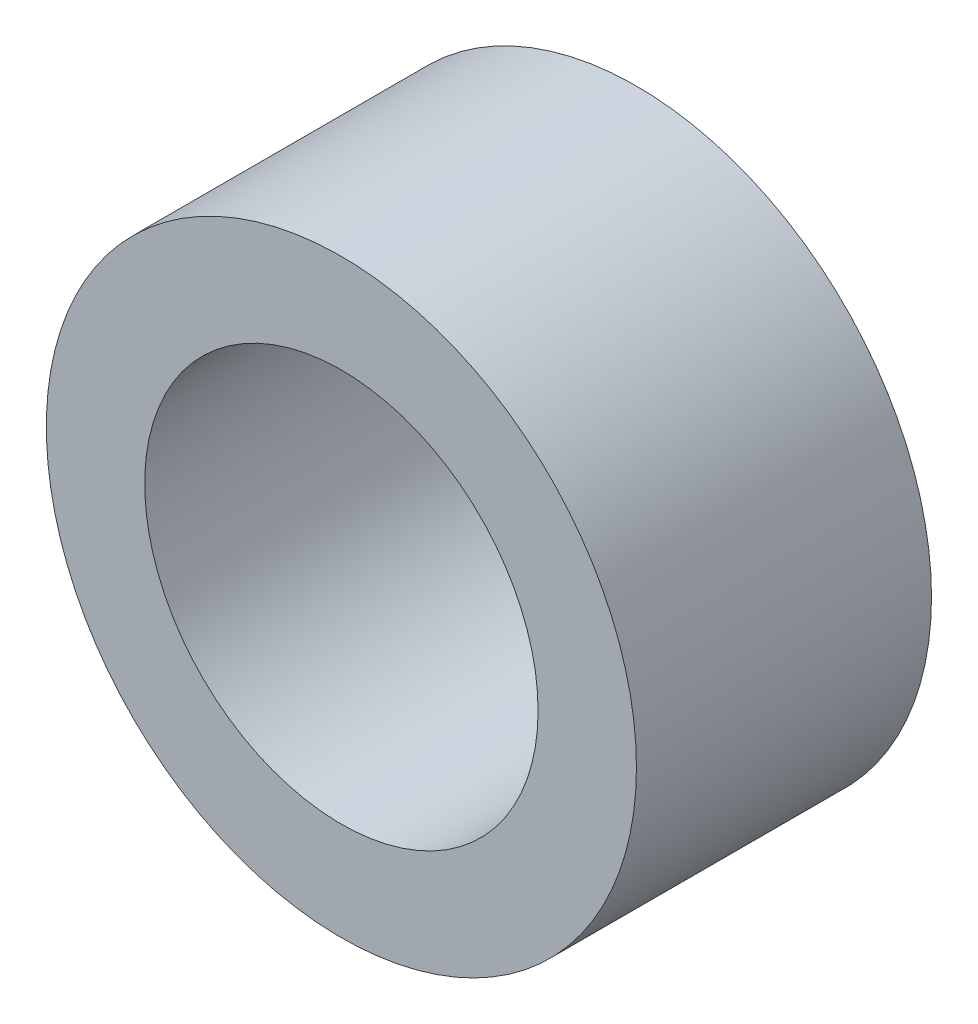
ISO-10303-21;
HEADER;
FILE_DESCRIPTION(('STEP AP214'),'2;1');
FILE_NAME('part.step','',(''),(''),'','','');
FILE_SCHEMA(('AUTOMOTIVE_DESIGN { 1 0 10303 214 1 1 1 1 }'));
ENDSEC;
DATA;
#1=APPLICATION_CONTEXT('core data for automotive mechanical design processes');
#2=APPLICATION_PROTOCOL_DEFINITION('international standard','automotive_design',2000,#1);
#3=PRODUCT_CONTEXT('',#1,'mechanical');
#4=PRODUCT('Part','Part','',(#3));
#5=PRODUCT_RELATED_PRODUCT_CATEGORY('part','',(#4));
#6=PRODUCT_DEFINITION_FORMATION('','',#4);
#7=PRODUCT_DEFINITION_CONTEXT('part definition',#1,'design');
#8=PRODUCT_DEFINITION('design','',#6,#7);
#9=PRODUCT_DEFINITION_SHAPE('','',#8);
#10=(LENGTH_UNIT() NAMED_UNIT(*) SI_UNIT(.MILLI.,.METRE.));
#11=(NAMED_UNIT(*) PLANE_ANGLE_UNIT() SI_UNIT($,.RADIAN.));
#12=(NAMED_UNIT(*) SI_UNIT($,.STERADIAN.) SOLID_ANGLE_UNIT());
#13=UNCERTAINTY_MEASURE_WITH_UNIT(LENGTH_MEASURE(1.E-05),#10,'distance_accuracy_value','');
#14=(GEOMETRIC_REPRESENTATION_CONTEXT(3) GLOBAL_UNCERTAINTY_ASSIGNED_CONTEXT((#13)) GLOBAL_UNIT_ASSIGNED_CONTEXT((#10,
#11,#12)) REPRESENTATION_CONTEXT('',''));
#15=CARTESIAN_POINT('',(0.,0.,0.));
#16=DIRECTION('',(0.,0.,1.));
#17=DIRECTION('',(1.,0.,0.));
#18=AXIS2_PLACEMENT_3D('',#15,#16,#17);
#19=CARTESIAN_POINT('',(0.,0.,1.5));
#20=DIRECTION('',(0.,0.,1.));
#21=DIRECTION('',(1.,0.,0.));
#22=AXIS2_PLACEMENT_3D('',#19,#20,#21);
#23=PLANE('',#22);
#24=CARTESIAN_POINT('',(0.,0.,1.5));
#25=DIRECTION('',(0.,0.,1.));
#26=DIRECTION('',(1.,0.,0.));
#27=AXIS2_PLACEMENT_3D('',#24,#25,#26);
#28=CIRCLE('',#27,3.);
#29=CARTESIAN_POINT('',(3.,0.,1.5));
#30=VERTEX_POINT('',#29);
#31=EDGE_CURVE('E10',#30,#30,#28,.T.);
#32=ORIENTED_EDGE('',*,*,#31,.T.);
#33=EDGE_LOOP('',(#32));
#34=FACE_BOUND('',#33,.T.);
#35=CARTESIAN_POINT('',(0.,0.,1.5));
#36=DIRECTION('',(0.,0.,1.));
#37=DIRECTION('',(1.,0.,0.));
#38=AXIS2_PLACEMENT_3D('',#35,#36,#37);
#39=CIRCLE('',#38,2.);
#40=CARTESIAN_POINT('',(2.,0.,1.5));
#41=VERTEX_POINT('',#40);
#42=EDGE_CURVE('E54',#41,#41,#39,.T.);
#43=ORIENTED_EDGE('',*,*,#42,.F.);
#44=EDGE_LOOP('',(#43));
#45=FACE_BOUND('',#44,.T.);
#46=ADVANCED_FACE('F41',(#34,#45),#23,.T.);
#47=CARTESIAN_POINT('',(0.,0.,-1.5));
#48=DIRECTION('',(0.,0.,1.));
#49=DIRECTION('',(1.,0.,0.));
#50=AXIS2_PLACEMENT_3D('',#47,#48,#49);
#51=PLANE('',#50);
#52=CARTESIAN_POINT('',(0.,0.,-1.5));
#53=DIRECTION('',(0.,0.,1.));
#54=DIRECTION('',(1.,0.,0.));
#55=AXIS2_PLACEMENT_3D('',#52,#53,#54);
#56=CIRCLE('',#55,3.);
#57=CARTESIAN_POINT('',(3.,0.,-1.5));
#58=VERTEX_POINT('',#57);
#59=EDGE_CURVE('E45',#58,#58,#56,.T.);
#60=ORIENTED_EDGE('',*,*,#59,.F.);
#61=EDGE_LOOP('',(#60));
#62=FACE_BOUND('',#61,.T.);
#63=CARTESIAN_POINT('',(0.,0.,-1.5));
#64=DIRECTION('',(0.,0.,1.));
#65=DIRECTION('',(1.,0.,0.));
#66=AXIS2_PLACEMENT_3D('',#63,#64,#65);
#67=CIRCLE('',#66,2.);
#68=CARTESIAN_POINT('',(2.,0.,-1.5));
#69=VERTEX_POINT('',#68);
#70=EDGE_CURVE('E56',#69,#69,#67,.T.);
#71=ORIENTED_EDGE('',*,*,#70,.T.);
#72=EDGE_LOOP('',(#71));
#73=FACE_BOUND('',#72,.T.);
#74=ADVANCED_FACE('F68',(#62,#73),#51,.F.);
#75=CARTESIAN_POINT('',(0.,0.,1.5));
#76=DIRECTION('',(0.,0.,-1.));
#77=DIRECTION('',(-1.,0.,0.));
#78=AXIS2_PLACEMENT_3D('',#75,#76,#77);
#79=CYLINDRICAL_SURFACE('',#78,3.);
#80=ORIENTED_EDGE('',*,*,#31,.F.);
#81=EDGE_LOOP('',(#80));
#82=FACE_BOUND('',#81,.T.);
#83=ORIENTED_EDGE('',*,*,#59,.T.);
#84=EDGE_LOOP('',(#83));
#85=FACE_BOUND('',#84,.T.);
#86=ADVANCED_FACE('F43',(#82,#85),#79,.T.);
#87=CARTESIAN_POINT('',(0.,0.,1.5));
#88=DIRECTION('',(0.,0.,-1.));
#89=DIRECTION('',(-1.,0.,0.));
#90=AXIS2_PLACEMENT_3D('',#87,#88,#89);
#91=CYLINDRICAL_SURFACE('',#90,2.);
#92=ORIENTED_EDGE('',*,*,#42,.T.);
#93=EDGE_LOOP('',(#92));
#94=FACE_BOUND('',#93,.T.);
#95=ORIENTED_EDGE('',*,*,#70,.F.);
#96=EDGE_LOOP('',(#95));
#97=FACE_BOUND('',#96,.T.);
#98=ADVANCED_FACE('F64',(#94,#97),#91,.F.);
#99=CLOSED_SHELL('',(#46,#74,#86,#98));
#100=MANIFOLD_SOLID_BREP('B2',#99);
#101=ADVANCED_BREP_SHAPE_REPRESENTATION('',(#18,#100),#14);
#102=SHAPE_DEFINITION_REPRESENTATION(#9,#101);
ENDSEC;
END-ISO-10303-21;
